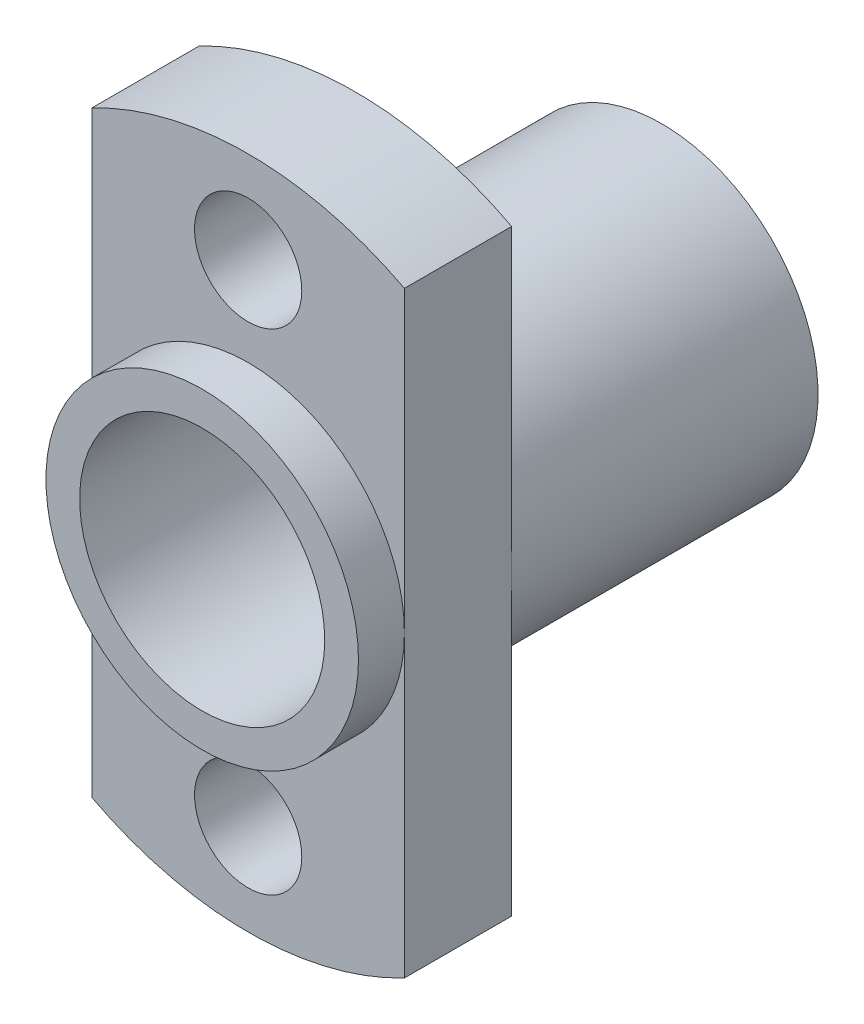
ISO-10303-21;
HEADER;
FILE_DESCRIPTION(('STEP AP214'),'2;1');
FILE_NAME('part.step','',(''),(''),'','','');
FILE_SCHEMA(('AUTOMOTIVE_DESIGN { 1 0 10303 214 1 1 1 1 }'));
ENDSEC;
DATA;
#1=APPLICATION_CONTEXT('core data for automotive mechanical design processes');
#2=APPLICATION_PROTOCOL_DEFINITION('international standard','automotive_design',2000,#1);
#3=PRODUCT_CONTEXT('',#1,'mechanical');
#4=PRODUCT('Part','Part','',(#3));
#5=PRODUCT_RELATED_PRODUCT_CATEGORY('part','',(#4));
#6=PRODUCT_DEFINITION_FORMATION('','',#4);
#7=PRODUCT_DEFINITION_CONTEXT('part definition',#1,'design');
#8=PRODUCT_DEFINITION('design','',#6,#7);
#9=PRODUCT_DEFINITION_SHAPE('','',#8);
#10=(LENGTH_UNIT() NAMED_UNIT(*) SI_UNIT(.MILLI.,.METRE.));
#11=(NAMED_UNIT(*) PLANE_ANGLE_UNIT() SI_UNIT($,.RADIAN.));
#12=(NAMED_UNIT(*) SI_UNIT($,.STERADIAN.) SOLID_ANGLE_UNIT());
#13=UNCERTAINTY_MEASURE_WITH_UNIT(LENGTH_MEASURE(1.E-05),#10,'distance_accuracy_value','');
#14=(GEOMETRIC_REPRESENTATION_CONTEXT(3) GLOBAL_UNCERTAINTY_ASSIGNED_CONTEXT((#13)) GLOBAL_UNIT_ASSIGNED_CONTEXT((#10,
#11,#12)) REPRESENTATION_CONTEXT('',''));
#15=CARTESIAN_POINT('',(0.,0.,0.));
#16=DIRECTION('',(0.,0.,1.));
#17=DIRECTION('',(1.,0.,0.));
#18=AXIS2_PLACEMENT_3D('',#15,#16,#17);
#19=CARTESIAN_POINT('',(0.,0.,0.));
#20=DIRECTION('',(0.,0.,1.));
#21=DIRECTION('',(1.,0.,0.));
#22=AXIS2_PLACEMENT_3D('',#19,#20,#21);
#23=PLANE('',#22);
#24=CARTESIAN_POINT('',(0.,8.,0.));
#25=DIRECTION('',(0.,0.,1.));
#26=DIRECTION('',(1.,0.,0.));
#27=AXIS2_PLACEMENT_3D('',#24,#25,#26);
#28=CIRCLE('',#27,1.75);
#29=CARTESIAN_POINT('',(1.75,8.,0.));
#30=VERTEX_POINT('',#29);
#31=EDGE_CURVE('E109',#30,#30,#28,.F.);
#32=ORIENTED_EDGE('',*,*,#31,.F.);
#33=EDGE_LOOP('',(#32));
#34=FACE_BOUND('',#33,.T.);
#35=CARTESIAN_POINT('',(0.,0.,0.));
#36=DIRECTION('',(0.,0.,-1.));
#37=DIRECTION('',(-1.,0.,0.));
#38=AXIS2_PLACEMENT_3D('',#35,#36,#37);
#39=CIRCLE('',#38,5.1);
#40=CARTESIAN_POINT('',(-5.1,0.,0.));
#41=VERTEX_POINT('',#40);
#42=CARTESIAN_POINT('',(5.1,0.,0.));
#43=VERTEX_POINT('',#42);
#44=EDGE_CURVE('E46',#41,#43,#39,.T.);
#45=ORIENTED_EDGE('',*,*,#44,.F.);
#46=DIRECTION('',(0.,-1.,0.));
#47=VECTOR('',#46,1.);
#48=CARTESIAN_POINT('',(-5.1,0.,0.));
#49=LINE('',#48,#47);
#50=CARTESIAN_POINT('',(-5.1,9.74628134213249,0.));
#51=VERTEX_POINT('',#50);
#52=EDGE_CURVE('E89',#51,#41,#49,.T.);
#53=ORIENTED_EDGE('',*,*,#52,.F.);
#54=CARTESIAN_POINT('',(0.,0.,0.));
#55=DIRECTION('',(0.,0.,1.));
#56=DIRECTION('',(1.,0.,0.));
#57=AXIS2_PLACEMENT_3D('',#54,#55,#56);
#58=CIRCLE('',#57,11.);
#59=CARTESIAN_POINT('',(5.1,9.74628134213249,0.));
#60=VERTEX_POINT('',#59);
#61=EDGE_CURVE('E39',#60,#51,#58,.T.);
#62=ORIENTED_EDGE('',*,*,#61,.F.);
#63=DIRECTION('',(0.,-1.,0.));
#64=VECTOR('',#63,1.);
#65=CARTESIAN_POINT('',(5.1,0.,0.));
#66=LINE('',#65,#64);
#67=EDGE_CURVE('E106',#60,#43,#66,.T.);
#68=ORIENTED_EDGE('',*,*,#67,.T.);
#69=EDGE_LOOP('',(#45,#53,#62,#68));
#70=FACE_BOUND('',#69,.T.);
#71=ADVANCED_FACE('F35',(#34,#70),#23,.F.);
#72=CARTESIAN_POINT('',(0.,0.,3.5));
#73=DIRECTION('',(0.,0.,1.));
#74=DIRECTION('',(1.,0.,0.));
#75=AXIS2_PLACEMENT_3D('',#72,#73,#74);
#76=PLANE('',#75);
#77=CARTESIAN_POINT('',(0.,8.,3.5));
#78=DIRECTION('',(0.,0.,1.));
#79=DIRECTION('',(1.,0.,0.));
#80=AXIS2_PLACEMENT_3D('',#77,#78,#79);
#81=CIRCLE('',#80,1.75);
#82=CARTESIAN_POINT('',(1.75,8.,3.5));
#83=VERTEX_POINT('',#82);
#84=EDGE_CURVE('E154',#83,#83,#81,.T.);
#85=ORIENTED_EDGE('',*,*,#84,.F.);
#86=EDGE_LOOP('',(#85));
#87=FACE_BOUND('',#86,.T.);
#88=CARTESIAN_POINT('',(0.,0.,3.5));
#89=DIRECTION('',(0.,0.,1.));
#90=DIRECTION('',(1.,0.,0.));
#91=AXIS2_PLACEMENT_3D('',#88,#89,#90);
#92=CIRCLE('',#91,5.1);
#93=CARTESIAN_POINT('',(5.1,0.,3.5));
#94=VERTEX_POINT('',#93);
#95=CARTESIAN_POINT('',(-5.1,0.,3.5));
#96=VERTEX_POINT('',#95);
#97=EDGE_CURVE('E165',#94,#96,#92,.T.);
#98=ORIENTED_EDGE('',*,*,#97,.F.);
#99=DIRECTION('',(0.,1.,0.));
#100=VECTOR('',#99,1.);
#101=CARTESIAN_POINT('',(5.1,0.,3.5));
#102=LINE('',#101,#100);
#103=CARTESIAN_POINT('',(5.1,9.74628134213249,3.5));
#104=VERTEX_POINT('',#103);
#105=EDGE_CURVE('E181',#94,#104,#102,.T.);
#106=ORIENTED_EDGE('',*,*,#105,.T.);
#107=CARTESIAN_POINT('',(0.,0.,3.5));
#108=DIRECTION('',(0.,0.,1.));
#109=DIRECTION('',(1.,0.,0.));
#110=AXIS2_PLACEMENT_3D('',#107,#108,#109);
#111=CIRCLE('',#110,11.);
#112=CARTESIAN_POINT('',(-5.1,9.74628134213249,3.5));
#113=VERTEX_POINT('',#112);
#114=EDGE_CURVE('E189',#104,#113,#111,.T.);
#115=ORIENTED_EDGE('',*,*,#114,.T.);
#116=DIRECTION('',(0.,1.,0.));
#117=VECTOR('',#116,1.);
#118=CARTESIAN_POINT('',(-5.1,0.,3.5));
#119=LINE('',#118,#117);
#120=EDGE_CURVE('E177',#96,#113,#119,.T.);
#121=ORIENTED_EDGE('',*,*,#120,.F.);
#122=EDGE_LOOP('',(#98,#106,#115,#121));
#123=FACE_BOUND('',#122,.T.);
#124=ADVANCED_FACE('F130',(#87,#123),#76,.T.);
#125=CARTESIAN_POINT('',(0.,0.,3.5));
#126=DIRECTION('',(0.,0.,-1.));
#127=DIRECTION('',(-1.,0.,0.));
#128=AXIS2_PLACEMENT_3D('',#125,#126,#127);
#129=CYLINDRICAL_SURFACE('',#128,11.);
#130=CARTESIAN_POINT('',(-5.1,-9.74628134213249,3.5));
#131=VERTEX_POINT('',#130);
#132=CARTESIAN_POINT('',(5.1,-9.74628134213249,3.5));
#133=VERTEX_POINT('',#132);
#134=EDGE_CURVE('E191',#131,#133,#111,.T.);
#135=ORIENTED_EDGE('',*,*,#134,.F.);
#136=DIRECTION('',(0.,0.,1.));
#137=VECTOR('',#136,1.);
#138=CARTESIAN_POINT('',(-5.1,-9.74628134213249,-0.00100000000000013));
#139=LINE('',#138,#137);
#140=CARTESIAN_POINT('',(-5.1,-9.74628134213249,0.));
#141=VERTEX_POINT('',#140);
#142=EDGE_CURVE('E176',#141,#131,#139,.T.);
#143=ORIENTED_EDGE('',*,*,#142,.F.);
#144=CARTESIAN_POINT('',(5.1,-9.74628134213249,0.));
#145=VERTEX_POINT('',#144);
#146=EDGE_CURVE('E99',#141,#145,#58,.T.);
#147=ORIENTED_EDGE('',*,*,#146,.T.);
#148=DIRECTION('',(0.,0.,1.));
#149=VECTOR('',#148,1.);
#150=CARTESIAN_POINT('',(5.1,-9.74628134213249,-0.00100000000000013));
#151=LINE('',#150,#149);
#152=EDGE_CURVE('E184',#145,#133,#151,.T.);
#153=ORIENTED_EDGE('',*,*,#152,.T.);
#154=EDGE_LOOP('',(#135,#143,#147,#153));
#155=FACE_BOUND('',#154,.T.);
#156=ADVANCED_FACE('F37',(#155),#129,.T.);
#157=ORIENTED_EDGE('',*,*,#61,.T.);
#158=DIRECTION('',(0.,0.,1.));
#159=VECTOR('',#158,1.);
#160=CARTESIAN_POINT('',(-5.1,9.74628134213249,-0.00100000000000013));
#161=LINE('',#160,#159);
#162=EDGE_CURVE('E94',#51,#113,#161,.T.);
#163=ORIENTED_EDGE('',*,*,#162,.T.);
#164=ORIENTED_EDGE('',*,*,#114,.F.);
#165=DIRECTION('',(0.,0.,1.));
#166=VECTOR('',#165,1.);
#167=CARTESIAN_POINT('',(5.1,9.74628134213249,-0.00100000000000013));
#168=LINE('',#167,#166);
#169=EDGE_CURVE('E185',#60,#104,#168,.T.);
#170=ORIENTED_EDGE('',*,*,#169,.F.);
#171=EDGE_LOOP('',(#157,#163,#164,#170));
#172=FACE_BOUND('',#171,.T.);
#173=ADVANCED_FACE('F148',(#172),#129,.T.);
#174=CARTESIAN_POINT('',(0.,-8.,3.5));
#175=DIRECTION('',(0.,0.,1.));
#176=DIRECTION('',(1.,0.,0.));
#177=AXIS2_PLACEMENT_3D('',#174,#175,#176);
#178=CIRCLE('',#177,1.75);
#179=CARTESIAN_POINT('',(1.75,-8.,3.5));
#180=VERTEX_POINT('',#179);
#181=EDGE_CURVE('E155',#180,#180,#178,.T.);
#182=ORIENTED_EDGE('',*,*,#181,.F.);
#183=EDGE_LOOP('',(#182));
#184=FACE_BOUND('',#183,.T.);
#185=EDGE_CURVE('E44',#96,#94,#92,.T.);
#186=ORIENTED_EDGE('',*,*,#185,.F.);
#187=EDGE_CURVE('E173',#131,#96,#119,.T.);
#188=ORIENTED_EDGE('',*,*,#187,.F.);
#189=ORIENTED_EDGE('',*,*,#134,.T.);
#190=EDGE_CURVE('E182',#133,#94,#102,.T.);
#191=ORIENTED_EDGE('',*,*,#190,.T.);
#192=EDGE_LOOP('',(#186,#188,#189,#191));
#193=FACE_BOUND('',#192,.T.);
#194=ADVANCED_FACE('F137',(#184,#193),#76,.T.);
#195=CARTESIAN_POINT('',(0.,-8.,0.));
#196=DIRECTION('',(0.,0.,1.));
#197=DIRECTION('',(1.,0.,0.));
#198=AXIS2_PLACEMENT_3D('',#195,#196,#197);
#199=CIRCLE('',#198,1.75);
#200=CARTESIAN_POINT('',(1.75,-8.,0.));
#201=VERTEX_POINT('',#200);
#202=EDGE_CURVE('E152',#201,#201,#199,.F.);
#203=ORIENTED_EDGE('',*,*,#202,.F.);
#204=EDGE_LOOP('',(#203));
#205=FACE_BOUND('',#204,.T.);
#206=EDGE_CURVE('E11',#43,#41,#39,.T.);
#207=ORIENTED_EDGE('',*,*,#206,.F.);
#208=EDGE_CURVE('E170',#43,#145,#66,.T.);
#209=ORIENTED_EDGE('',*,*,#208,.T.);
#210=ORIENTED_EDGE('',*,*,#146,.F.);
#211=EDGE_CURVE('E91',#41,#141,#49,.T.);
#212=ORIENTED_EDGE('',*,*,#211,.F.);
#213=EDGE_LOOP('',(#207,#209,#210,#212));
#214=FACE_BOUND('',#213,.T.);
#215=ADVANCED_FACE('F102',(#205,#214),#23,.F.);
#216=CARTESIAN_POINT('',(5.1,0.,-0.00100000000000013));
#217=DIRECTION('',(1.,0.,0.));
#218=DIRECTION('',(0.,0.,-1.));
#219=AXIS2_PLACEMENT_3D('',#216,#217,#218);
#220=PLANE('',#219);
#221=ORIENTED_EDGE('',*,*,#169,.T.);
#222=ORIENTED_EDGE('',*,*,#105,.F.);
#223=ORIENTED_EDGE('',*,*,#190,.F.);
#224=ORIENTED_EDGE('',*,*,#152,.F.);
#225=ORIENTED_EDGE('',*,*,#208,.F.);
#226=ORIENTED_EDGE('',*,*,#67,.F.);
#227=EDGE_LOOP('',(#221,#222,#223,#224,#225,#226));
#228=FACE_BOUND('',#227,.T.);
#229=ADVANCED_FACE('F140',(#228),#220,.T.);
#230=CARTESIAN_POINT('',(-5.1,0.,-0.00100000000000013));
#231=DIRECTION('',(1.,0.,0.));
#232=DIRECTION('',(0.,0.,-1.));
#233=AXIS2_PLACEMENT_3D('',#230,#231,#232);
#234=PLANE('',#233);
#235=ORIENTED_EDGE('',*,*,#52,.T.);
#236=ORIENTED_EDGE('',*,*,#211,.T.);
#237=ORIENTED_EDGE('',*,*,#142,.T.);
#238=ORIENTED_EDGE('',*,*,#187,.T.);
#239=ORIENTED_EDGE('',*,*,#120,.T.);
#240=ORIENTED_EDGE('',*,*,#162,.F.);
#241=EDGE_LOOP('',(#235,#236,#237,#238,#239,#240));
#242=FACE_BOUND('',#241,.T.);
#243=ADVANCED_FACE('F90',(#242),#234,.F.);
#244=CARTESIAN_POINT('',(0.,0.,5.));
#245=DIRECTION('',(0.,0.,-1.));
#246=DIRECTION('',(-1.,0.,0.));
#247=AXIS2_PLACEMENT_3D('',#244,#245,#246);
#248=CYLINDRICAL_SURFACE('',#247,5.1);
#249=CARTESIAN_POINT('',(0.,0.,5.));
#250=DIRECTION('',(0.,0.,1.));
#251=DIRECTION('',(1.,0.,0.));
#252=AXIS2_PLACEMENT_3D('',#249,#250,#251);
#253=CIRCLE('',#252,5.1);
#254=CARTESIAN_POINT('',(5.1,0.,5.));
#255=VERTEX_POINT('',#254);
#256=EDGE_CURVE('E167',#255,#255,#253,.T.);
#257=ORIENTED_EDGE('',*,*,#256,.F.);
#258=EDGE_LOOP('',(#257));
#259=FACE_BOUND('',#258,.T.);
#260=ORIENTED_EDGE('',*,*,#97,.T.);
#261=ORIENTED_EDGE('',*,*,#185,.T.);
#262=EDGE_LOOP('',(#260,#261));
#263=FACE_BOUND('',#262,.T.);
#264=ADVANCED_FACE('F125',(#259,#263),#248,.T.);
#265=CARTESIAN_POINT('',(0.,0.,5.));
#266=DIRECTION('',(0.,0.,1.));
#267=DIRECTION('',(1.,0.,0.));
#268=AXIS2_PLACEMENT_3D('',#265,#266,#267);
#269=PLANE('',#268);
#270=CARTESIAN_POINT('',(0.,0.,5.));
#271=DIRECTION('',(0.,0.,1.));
#272=DIRECTION('',(1.,0.,0.));
#273=AXIS2_PLACEMENT_3D('',#270,#271,#272);
#274=CIRCLE('',#273,4.);
#275=CARTESIAN_POINT('',(4.,0.,5.));
#276=VERTEX_POINT('',#275);
#277=EDGE_CURVE('E160',#276,#276,#274,.T.);
#278=ORIENTED_EDGE('',*,*,#277,.F.);
#279=EDGE_LOOP('',(#278));
#280=FACE_BOUND('',#279,.T.);
#281=ORIENTED_EDGE('',*,*,#256,.T.);
#282=EDGE_LOOP('',(#281));
#283=FACE_BOUND('',#282,.T.);
#284=ADVANCED_FACE('F113',(#280,#283),#269,.T.);
#285=CARTESIAN_POINT('',(0.,0.,-10.));
#286=DIRECTION('',(0.,0.,1.));
#287=DIRECTION('',(1.,0.,0.));
#288=AXIS2_PLACEMENT_3D('',#285,#286,#287);
#289=CYLINDRICAL_SURFACE('',#288,5.1);
#290=CARTESIAN_POINT('',(0.,0.,-10.));
#291=DIRECTION('',(0.,0.,-1.));
#292=DIRECTION('',(-1.,0.,0.));
#293=AXIS2_PLACEMENT_3D('',#290,#291,#292);
#294=CIRCLE('',#293,5.1);
#295=CARTESIAN_POINT('',(-5.1,0.,-10.));
#296=VERTEX_POINT('',#295);
#297=EDGE_CURVE('E108',#296,#296,#294,.T.);
#298=ORIENTED_EDGE('',*,*,#297,.F.);
#299=EDGE_LOOP('',(#298));
#300=FACE_BOUND('',#299,.T.);
#301=ORIENTED_EDGE('',*,*,#44,.T.);
#302=ORIENTED_EDGE('',*,*,#206,.T.);
#303=EDGE_LOOP('',(#301,#302));
#304=FACE_BOUND('',#303,.T.);
#305=ADVANCED_FACE('F110',(#300,#304),#289,.T.);
#306=CARTESIAN_POINT('',(0.,0.,-10.));
#307=DIRECTION('',(0.,0.,-1.));
#308=DIRECTION('',(-1.,0.,0.));
#309=AXIS2_PLACEMENT_3D('',#306,#307,#308);
#310=PLANE('',#309);
#311=CARTESIAN_POINT('',(0.,0.,-10.));
#312=DIRECTION('',(0.,0.,-1.));
#313=DIRECTION('',(-1.,0.,0.));
#314=AXIS2_PLACEMENT_3D('',#311,#312,#313);
#315=CIRCLE('',#314,4.);
#316=CARTESIAN_POINT('',(-4.,0.,-10.));
#317=VERTEX_POINT('',#316);
#318=EDGE_CURVE('E271',#317,#317,#315,.F.);
#319=ORIENTED_EDGE('',*,*,#318,.T.);
#320=EDGE_LOOP('',(#319));
#321=FACE_BOUND('',#320,.T.);
#322=ORIENTED_EDGE('',*,*,#297,.T.);
#323=EDGE_LOOP('',(#322));
#324=FACE_BOUND('',#323,.T.);
#325=ADVANCED_FACE('F112',(#321,#324),#310,.T.);
#326=CARTESIAN_POINT('',(0.,-8.,-10.001));
#327=DIRECTION('',(0.,0.,1.));
#328=DIRECTION('',(1.,0.,0.));
#329=AXIS2_PLACEMENT_3D('',#326,#327,#328);
#330=CYLINDRICAL_SURFACE('',#329,1.75);
#331=CARTESIAN_POINT('',(1.75,-8.,3.5));
#332=CARTESIAN_POINT('',(1.75,-8.,3.46354166666667));
#333=CARTESIAN_POINT('',(1.75,-8.,3.42708333333333));
#334=CARTESIAN_POINT('',(1.75,-8.,3.35416666666667));
#335=CARTESIAN_POINT('',(1.75,-8.,3.31770833333333));
#336=CARTESIAN_POINT('',(1.75,-8.,3.24479166666667));
#337=CARTESIAN_POINT('',(1.75,-8.,3.20833333333333));
#338=CARTESIAN_POINT('',(1.75,-8.,3.13541666666667));
#339=CARTESIAN_POINT('',(1.75,-8.,3.09895833333333));
#340=CARTESIAN_POINT('',(1.75,-8.,3.02604166666667));
#341=CARTESIAN_POINT('',(1.75,-8.,2.98958333333333));
#342=CARTESIAN_POINT('',(1.75,-8.,2.91666666666667));
#343=CARTESIAN_POINT('',(1.75,-8.,2.88020833333333));
#344=CARTESIAN_POINT('',(1.75,-8.,2.80729166666667));
#345=CARTESIAN_POINT('',(1.75,-8.,2.77083333333333));
#346=CARTESIAN_POINT('',(1.75,-8.,2.69791666666667));
#347=CARTESIAN_POINT('',(1.75,-8.,2.66145833333333));
#348=CARTESIAN_POINT('',(1.75,-8.,2.58854166666667));
#349=CARTESIAN_POINT('',(1.75,-8.,2.55208333333333));
#350=CARTESIAN_POINT('',(1.75,-8.,2.47916666666667));
#351=CARTESIAN_POINT('',(1.75,-8.,2.44270833333333));
#352=CARTESIAN_POINT('',(1.75,-8.,2.36979166666667));
#353=CARTESIAN_POINT('',(1.75,-8.,2.33333333333333));
#354=CARTESIAN_POINT('',(1.75,-8.,2.26041666666667));
#355=CARTESIAN_POINT('',(1.75,-8.,2.22395833333333));
#356=CARTESIAN_POINT('',(1.75,-8.,2.15104166666667));
#357=CARTESIAN_POINT('',(1.75,-8.,2.11458333333333));
#358=CARTESIAN_POINT('',(1.75,-8.,2.04166666666667));
#359=CARTESIAN_POINT('',(1.75,-8.,2.00520833333333));
#360=CARTESIAN_POINT('',(1.75,-8.,1.93229166666667));
#361=CARTESIAN_POINT('',(1.75,-8.,1.89583333333333));
#362=CARTESIAN_POINT('',(1.75,-8.,1.82291666666667));
#363=CARTESIAN_POINT('',(1.75,-8.,1.78645833333333));
#364=CARTESIAN_POINT('',(1.75,-8.,1.71354166666667));
#365=CARTESIAN_POINT('',(1.75,-8.,1.67708333333333));
#366=CARTESIAN_POINT('',(1.75,-8.,1.60416666666667));
#367=CARTESIAN_POINT('',(1.75,-8.,1.56770833333333));
#368=CARTESIAN_POINT('',(1.75,-8.,1.49479166666667));
#369=CARTESIAN_POINT('',(1.75,-8.,1.45833333333333));
#370=CARTESIAN_POINT('',(1.75,-8.,1.38541666666667));
#371=CARTESIAN_POINT('',(1.75,-8.,1.34895833333333));
#372=CARTESIAN_POINT('',(1.75,-8.,1.27604166666667));
#373=CARTESIAN_POINT('',(1.75,-8.,1.23958333333333));
#374=CARTESIAN_POINT('',(1.75,-8.,1.16666666666667));
#375=CARTESIAN_POINT('',(1.75,-8.,1.13020833333333));
#376=CARTESIAN_POINT('',(1.75,-8.,1.05729166666667));
#377=CARTESIAN_POINT('',(1.75,-8.,1.02083333333333));
#378=CARTESIAN_POINT('',(1.75,-8.,0.947916666666666));
#379=CARTESIAN_POINT('',(1.75,-8.,0.911458333333332));
#380=CARTESIAN_POINT('',(1.75,-8.,0.838541666666666));
#381=CARTESIAN_POINT('',(1.75,-8.,0.802083333333332));
#382=CARTESIAN_POINT('',(1.75,-8.,0.729166666666666));
#383=CARTESIAN_POINT('',(1.75,-8.,0.692708333333332));
#384=CARTESIAN_POINT('',(1.75,-8.,0.619791666666666));
#385=CARTESIAN_POINT('',(1.75,-8.,0.583333333333332));
#386=CARTESIAN_POINT('',(1.75,-8.,0.510416666666665));
#387=CARTESIAN_POINT('',(1.75,-8.,0.473958333333332));
#388=CARTESIAN_POINT('',(1.75,-8.,0.401041666666665));
#389=CARTESIAN_POINT('',(1.75,-8.,0.364583333333332));
#390=CARTESIAN_POINT('',(1.75,-8.,0.291666666666665));
#391=CARTESIAN_POINT('',(1.75,-8.,0.255208333333332));
#392=CARTESIAN_POINT('',(1.75,-8.,0.182291666666665));
#393=CARTESIAN_POINT('',(1.75,-8.,0.145833333333332));
#394=CARTESIAN_POINT('',(1.75,-8.,0.072916666666665));
#395=CARTESIAN_POINT('',(1.75,-8.,0.0364583333333316));
#396=CARTESIAN_POINT('',(1.75,-8.,0.));
#397=B_SPLINE_CURVE_WITH_KNOTS('',3,(#331,#332,#333,#334,#335,#336,#337,#338,#339,#340,#341,
#342,#343,#344,#345,#346,#347,#348,#349,#350,#351,#352,#353,#354,#355,#356,#357,#358,#359,#360,
#361,#362,#363,#364,#365,#366,#367,#368,#369,#370,#371,#372,#373,#374,#375,#376,#377,#378,#379,
#380,#381,#382,#383,#384,#385,#386,#387,#388,#389,#390,#391,#392,#393,#394,#395,#396),
.UNSPECIFIED.,.F.,.F.,(4,2,2,2,2,2,2,2,2,2,2,2,2,2,2,2,2,2,2,2,2,2,2,2,2,2,2,2,2,2,2,2,4),(0.,
0.109375,0.21875,0.328125,0.4375,0.546875,0.656250000000001,0.765625000000001,0.875000000000001,
0.984375000000001,1.09375,1.203125,1.3125,1.421875,1.53125,1.640625,1.75,1.859375,1.96875,
2.078125,2.1875,2.296875,2.40625,2.515625,2.625,2.734375,2.84375,2.953125,3.0625,3.171875,
3.28125,3.390625,3.5),.UNSPECIFIED.);
#398=EDGE_CURVE('BSEAM121',#180,#201,#397,.T.);
#399=ORIENTED_EDGE('',*,*,#181,.T.);
#400=ORIENTED_EDGE('',*,*,#202,.T.);
#401=ORIENTED_EDGE('',*,*,#398,.T.);
#402=ORIENTED_EDGE('',*,*,#398,.F.);
#403=EDGE_LOOP('',(#399,#401,#400,#402));
#404=FACE_BOUND('',#403,.T.);
#405=ADVANCED_FACE('F121',(#404),#330,.F.);
#406=CARTESIAN_POINT('',(0.,8.,-10.001));
#407=DIRECTION('',(0.,0.,1.));
#408=DIRECTION('',(1.,0.,0.));
#409=AXIS2_PLACEMENT_3D('',#406,#407,#408);
#410=CYLINDRICAL_SURFACE('',#409,1.75);
#411=CARTESIAN_POINT('',(1.75,8.,3.5));
#412=CARTESIAN_POINT('',(1.75,8.,3.46354166666667));
#413=CARTESIAN_POINT('',(1.75,8.,3.42708333333333));
#414=CARTESIAN_POINT('',(1.75,8.,3.35416666666667));
#415=CARTESIAN_POINT('',(1.75,8.,3.31770833333333));
#416=CARTESIAN_POINT('',(1.75,8.,3.24479166666667));
#417=CARTESIAN_POINT('',(1.75,8.,3.20833333333333));
#418=CARTESIAN_POINT('',(1.75,8.,3.13541666666667));
#419=CARTESIAN_POINT('',(1.75,8.,3.09895833333333));
#420=CARTESIAN_POINT('',(1.75,8.,3.02604166666667));
#421=CARTESIAN_POINT('',(1.75,8.,2.98958333333333));
#422=CARTESIAN_POINT('',(1.75,8.,2.91666666666667));
#423=CARTESIAN_POINT('',(1.75,8.,2.88020833333333));
#424=CARTESIAN_POINT('',(1.75,8.,2.80729166666667));
#425=CARTESIAN_POINT('',(1.75,8.,2.77083333333333));
#426=CARTESIAN_POINT('',(1.75,8.,2.69791666666667));
#427=CARTESIAN_POINT('',(1.75,8.,2.66145833333333));
#428=CARTESIAN_POINT('',(1.75,8.,2.58854166666667));
#429=CARTESIAN_POINT('',(1.75,8.,2.55208333333333));
#430=CARTESIAN_POINT('',(1.75,8.,2.47916666666667));
#431=CARTESIAN_POINT('',(1.75,8.,2.44270833333333));
#432=CARTESIAN_POINT('',(1.75,8.,2.36979166666667));
#433=CARTESIAN_POINT('',(1.75,8.,2.33333333333333));
#434=CARTESIAN_POINT('',(1.75,8.,2.26041666666667));
#435=CARTESIAN_POINT('',(1.75,8.,2.22395833333333));
#436=CARTESIAN_POINT('',(1.75,8.,2.15104166666667));
#437=CARTESIAN_POINT('',(1.75,8.,2.11458333333333));
#438=CARTESIAN_POINT('',(1.75,8.,2.04166666666667));
#439=CARTESIAN_POINT('',(1.75,8.,2.00520833333333));
#440=CARTESIAN_POINT('',(1.75,8.,1.93229166666667));
#441=CARTESIAN_POINT('',(1.75,8.,1.89583333333333));
#442=CARTESIAN_POINT('',(1.75,8.,1.82291666666667));
#443=CARTESIAN_POINT('',(1.75,8.,1.78645833333333));
#444=CARTESIAN_POINT('',(1.75,8.,1.71354166666667));
#445=CARTESIAN_POINT('',(1.75,8.,1.67708333333333));
#446=CARTESIAN_POINT('',(1.75,8.,1.60416666666667));
#447=CARTESIAN_POINT('',(1.75,8.,1.56770833333333));
#448=CARTESIAN_POINT('',(1.75,8.,1.49479166666667));
#449=CARTESIAN_POINT('',(1.75,8.,1.45833333333333));
#450=CARTESIAN_POINT('',(1.75,8.,1.38541666666667));
#451=CARTESIAN_POINT('',(1.75,8.,1.34895833333333));
#452=CARTESIAN_POINT('',(1.75,8.,1.27604166666667));
#453=CARTESIAN_POINT('',(1.75,8.,1.23958333333333));
#454=CARTESIAN_POINT('',(1.75,8.,1.16666666666667));
#455=CARTESIAN_POINT('',(1.75,8.,1.13020833333333));
#456=CARTESIAN_POINT('',(1.75,8.,1.05729166666667));
#457=CARTESIAN_POINT('',(1.75,8.,1.02083333333333));
#458=CARTESIAN_POINT('',(1.75,8.,0.947916666666666));
#459=CARTESIAN_POINT('',(1.75,8.,0.911458333333332));
#460=CARTESIAN_POINT('',(1.75,8.,0.838541666666666));
#461=CARTESIAN_POINT('',(1.75,8.,0.802083333333332));
#462=CARTESIAN_POINT('',(1.75,8.,0.729166666666666));
#463=CARTESIAN_POINT('',(1.75,8.,0.692708333333332));
#464=CARTESIAN_POINT('',(1.75,8.,0.619791666666666));
#465=CARTESIAN_POINT('',(1.75,8.,0.583333333333332));
#466=CARTESIAN_POINT('',(1.75,8.,0.510416666666665));
#467=CARTESIAN_POINT('',(1.75,8.,0.473958333333332));
#468=CARTESIAN_POINT('',(1.75,8.,0.401041666666665));
#469=CARTESIAN_POINT('',(1.75,8.,0.364583333333332));
#470=CARTESIAN_POINT('',(1.75,8.,0.291666666666665));
#471=CARTESIAN_POINT('',(1.75,8.,0.255208333333332));
#472=CARTESIAN_POINT('',(1.75,8.,0.182291666666665));
#473=CARTESIAN_POINT('',(1.75,8.,0.145833333333332));
#474=CARTESIAN_POINT('',(1.75,8.,0.072916666666665));
#475=CARTESIAN_POINT('',(1.75,8.,0.0364583333333316));
#476=CARTESIAN_POINT('',(1.75,8.,0.));
#477=B_SPLINE_CURVE_WITH_KNOTS('',3,(#411,#412,#413,#414,#415,#416,#417,#418,#419,#420,#421,
#422,#423,#424,#425,#426,#427,#428,#429,#430,#431,#432,#433,#434,#435,#436,#437,#438,#439,#440,
#441,#442,#443,#444,#445,#446,#447,#448,#449,#450,#451,#452,#453,#454,#455,#456,#457,#458,#459,
#460,#461,#462,#463,#464,#465,#466,#467,#468,#469,#470,#471,#472,#473,#474,#475,#476),
.UNSPECIFIED.,.F.,.F.,(4,2,2,2,2,2,2,2,2,2,2,2,2,2,2,2,2,2,2,2,2,2,2,2,2,2,2,2,2,2,2,2,4),(0.,
0.109375,0.21875,0.328125,0.4375,0.546875,0.656250000000001,0.765625000000001,0.875000000000001,
0.984375000000001,1.09375,1.203125,1.3125,1.421875,1.53125,1.640625,1.75,1.859375,1.96875,
2.078125,2.1875,2.296875,2.40625,2.515625,2.625,2.734375,2.84375,2.953125,3.0625,3.171875,
3.28125,3.390625,3.5),.UNSPECIFIED.);
#478=EDGE_CURVE('BSEAM237',#83,#30,#477,.T.);
#479=ORIENTED_EDGE('',*,*,#84,.T.);
#480=ORIENTED_EDGE('',*,*,#31,.T.);
#481=ORIENTED_EDGE('',*,*,#478,.T.);
#482=ORIENTED_EDGE('',*,*,#478,.F.);
#483=EDGE_LOOP('',(#479,#481,#480,#482));
#484=FACE_BOUND('',#483,.T.);
#485=ADVANCED_FACE('F237',(#484),#410,.F.);
#486=CARTESIAN_POINT('',(0.,0.,-10.001));
#487=DIRECTION('',(0.,0.,1.));
#488=DIRECTION('',(1.,0.,0.));
#489=AXIS2_PLACEMENT_3D('',#486,#487,#488);
#490=CYLINDRICAL_SURFACE('',#489,4.);
#491=ORIENTED_EDGE('',*,*,#318,.F.);
#492=EDGE_LOOP('',(#491));
#493=FACE_BOUND('',#492,.T.);
#494=ORIENTED_EDGE('',*,*,#277,.T.);
#495=EDGE_LOOP('',(#494));
#496=FACE_BOUND('',#495,.T.);
#497=ADVANCED_FACE('F247',(#493,#496),#490,.F.);
#498=CLOSED_SHELL('',(#71,#124,#156,#173,#194,#215,#229,#243,#264,#284,#305,#325,#405,#485,#497));
#499=MANIFOLD_SOLID_BREP('B2',#498);
#500=ADVANCED_BREP_SHAPE_REPRESENTATION('',(#18,#499),#14);
#501=SHAPE_DEFINITION_REPRESENTATION(#9,#500);
ENDSEC;
END-ISO-10303-21;
